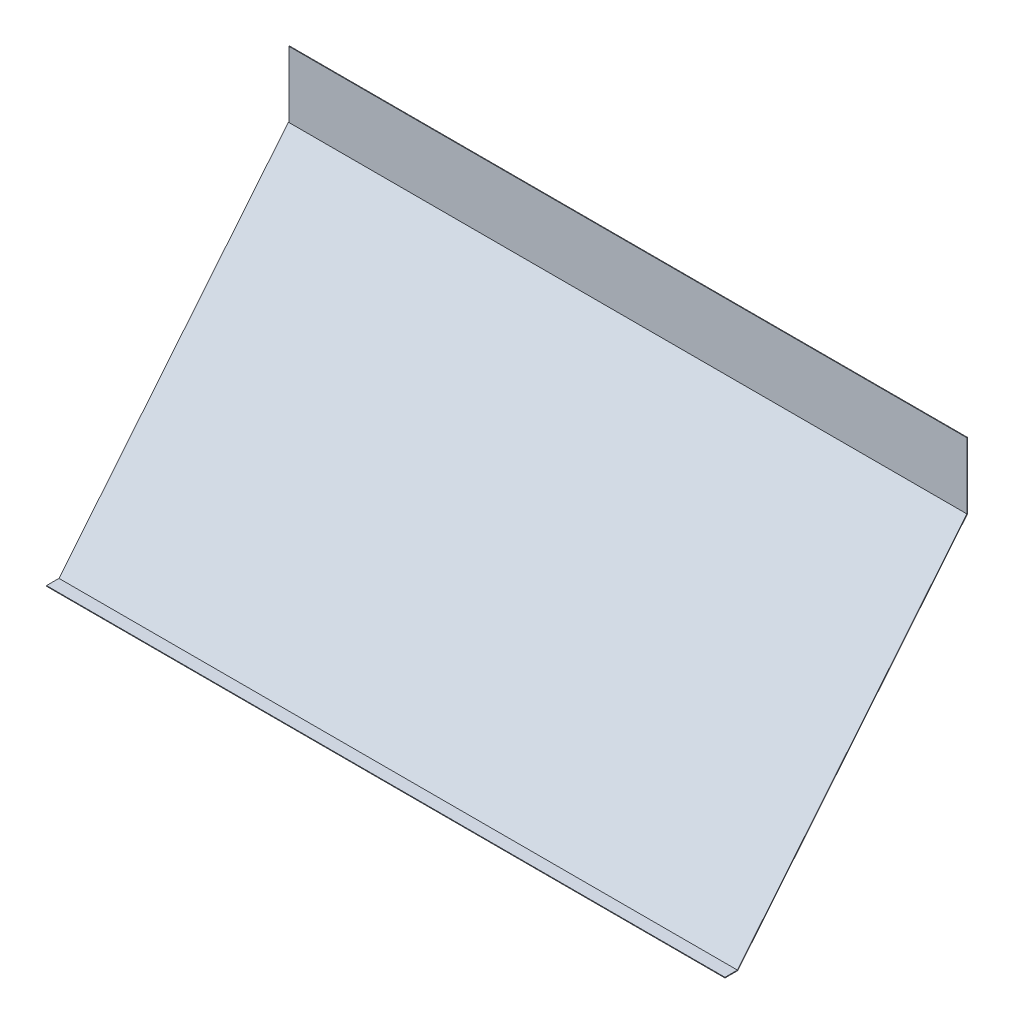
ISO-10303-21;
HEADER;
FILE_DESCRIPTION(('STEP AP214'),'2;1');
FILE_NAME('part.step','',(''),(''),'','','');
FILE_SCHEMA(('AUTOMOTIVE_DESIGN { 1 0 10303 214 1 1 1 1 }'));
ENDSEC;
DATA;
#1=APPLICATION_CONTEXT('core data for automotive mechanical design processes');
#2=APPLICATION_PROTOCOL_DEFINITION('international standard','automotive_design',2000,#1);
#3=PRODUCT_CONTEXT('',#1,'mechanical');
#4=PRODUCT('Part','Part','',(#3));
#5=PRODUCT_RELATED_PRODUCT_CATEGORY('part','',(#4));
#6=PRODUCT_DEFINITION_FORMATION('','',#4);
#7=PRODUCT_DEFINITION_CONTEXT('part definition',#1,'design');
#8=PRODUCT_DEFINITION('design','',#6,#7);
#9=PRODUCT_DEFINITION_SHAPE('','',#8);
#10=(LENGTH_UNIT() NAMED_UNIT(*) SI_UNIT(.MILLI.,.METRE.));
#11=(NAMED_UNIT(*) PLANE_ANGLE_UNIT() SI_UNIT($,.RADIAN.));
#12=(NAMED_UNIT(*) SI_UNIT($,.STERADIAN.) SOLID_ANGLE_UNIT());
#13=UNCERTAINTY_MEASURE_WITH_UNIT(LENGTH_MEASURE(1.E-05),#10,'distance_accuracy_value','');
#14=(GEOMETRIC_REPRESENTATION_CONTEXT(3) GLOBAL_UNCERTAINTY_ASSIGNED_CONTEXT((#13)) GLOBAL_UNIT_ASSIGNED_CONTEXT((#10,
#11,#12)) REPRESENTATION_CONTEXT('',''));
#15=CARTESIAN_POINT('',(0.,0.,0.));
#16=DIRECTION('',(0.,0.,1.));
#17=DIRECTION('',(1.,0.,0.));
#18=AXIS2_PLACEMENT_3D('',#15,#16,#17);
#19=CARTESIAN_POINT('',(545.,1.,-10.));
#20=DIRECTION('',(-1.,0.,0.));
#21=DIRECTION('',(0.,0.,1.));
#22=AXIS2_PLACEMENT_3D('',#19,#20,#21);
#23=PLANE('',#22);
#24=DIRECTION('',(0.,0.,-1.));
#25=VECTOR('',#24,1.);
#26=CARTESIAN_POINT('',(545.,0.,-10.));
#27=LINE('',#26,#25);
#28=CARTESIAN_POINT('',(545.,0.,10.));
#29=VERTEX_POINT('',#28);
#30=CARTESIAN_POINT('',(545.,0.,-10.));
#31=VERTEX_POINT('',#30);
#32=EDGE_CURVE('E190',#29,#31,#27,.T.);
#33=ORIENTED_EDGE('',*,*,#32,.T.);
#34=CARTESIAN_POINT('',(545.,1.,-10.));
#35=DIRECTION('',(-1.,0.,0.));
#36=DIRECTION('',(0.,0.,1.));
#37=AXIS2_PLACEMENT_3D('',#34,#35,#36);
#38=CIRCLE('',#37,1.);
#39=CARTESIAN_POINT('',(545.,0.366619127372445,-10.7738402097265));
#40=VERTEX_POINT('',#39);
#41=EDGE_CURVE('E182',#40,#31,#38,.T.);
#42=ORIENTED_EDGE('',*,*,#41,.F.);
#43=DIRECTION('',(0.,-0.773840209726502,0.633380872627555));
#44=VECTOR('',#43,1.);
#45=CARTESIAN_POINT('',(545.,450.741621188197,-379.401508078963));
#46=LINE('',#45,#44);
#47=CARTESIAN_POINT('',(545.,450.741621188197,-379.401508078963));
#48=VERTEX_POINT('',#47);
#49=EDGE_CURVE('E172',#48,#40,#46,.T.);
#50=ORIENTED_EDGE('',*,*,#49,.F.);
#51=CARTESIAN_POINT('',(545.,451.375002060824,-378.627667869237));
#52=DIRECTION('',(1.,0.,0.));
#53=DIRECTION('',(0.,0.,1.));
#54=AXIS2_PLACEMENT_3D('',#51,#52,#53);
#55=CIRCLE('',#54,0.999999999999975);
#56=CARTESIAN_POINT('',(545.,451.375002060824,-379.627667869237));
#57=VERTEX_POINT('',#56);
#58=EDGE_CURVE('E149',#48,#57,#55,.T.);
#59=ORIENTED_EDGE('',*,*,#58,.T.);
#60=DIRECTION('',(0.,-1.,0.));
#61=VECTOR('',#60,1.);
#62=CARTESIAN_POINT('',(545.,557.375002060909,-379.627667869231));
#63=LINE('',#62,#61);
#64=CARTESIAN_POINT('',(545.,557.375002060909,-379.627667869231));
#65=VERTEX_POINT('',#64);
#66=EDGE_CURVE('E130',#65,#57,#63,.T.);
#67=ORIENTED_EDGE('',*,*,#66,.F.);
#68=DIRECTION('',(0.,0.,-1.));
#69=VECTOR('',#68,1.);
#70=CARTESIAN_POINT('',(545.,557.375002060909,-378.627667869231));
#71=LINE('',#70,#69);
#72=CARTESIAN_POINT('',(545.,557.375002060909,-378.627667869231));
#73=VERTEX_POINT('',#72);
#74=EDGE_CURVE('E136',#73,#65,#71,.T.);
#75=ORIENTED_EDGE('',*,*,#74,.F.);
#76=DIRECTION('',(0.,-1.,0.));
#77=VECTOR('',#76,1.);
#78=CARTESIAN_POINT('',(545.,557.375002060909,-378.627667869231));
#79=LINE('',#78,#77);
#80=CARTESIAN_POINT('',(545.,451.375002060824,-378.627667869237));
#81=VERTEX_POINT('',#80);
#82=EDGE_CURVE('E224',#73,#81,#79,.T.);
#83=ORIENTED_EDGE('',*,*,#82,.T.);
#84=DIRECTION('',(0.,-0.773840209726502,0.633380872627555));
#85=VECTOR('',#84,1.);
#86=CARTESIAN_POINT('',(545.,451.375002060824,-378.627667869237));
#87=LINE('',#86,#85);
#88=CARTESIAN_POINT('',(545.,1.,-10.));
#89=VERTEX_POINT('',#88);
#90=EDGE_CURVE('E175',#81,#89,#87,.T.);
#91=ORIENTED_EDGE('',*,*,#90,.T.);
#92=DIRECTION('',(0.,0.,-1.));
#93=VECTOR('',#92,1.);
#94=CARTESIAN_POINT('',(545.,1.,-10.));
#95=LINE('',#94,#93);
#96=CARTESIAN_POINT('',(545.,1.,10.));
#97=VERTEX_POINT('',#96);
#98=EDGE_CURVE('E81',#97,#89,#95,.T.);
#99=ORIENTED_EDGE('',*,*,#98,.F.);
#100=DIRECTION('',(0.,-1.,0.));
#101=VECTOR('',#100,1.);
#102=CARTESIAN_POINT('',(545.,1.,10.));
#103=LINE('',#102,#101);
#104=EDGE_CURVE('E43',#97,#29,#103,.T.);
#105=ORIENTED_EDGE('',*,*,#104,.T.);
#106=EDGE_LOOP('',(#33,#42,#50,#59,#67,#75,#83,#91,#99,#105));
#107=FACE_BOUND('',#106,.T.);
#108=ADVANCED_FACE('F36',(#107),#23,.F.);
#109=CARTESIAN_POINT('',(-545.,1.,-10.));
#110=DIRECTION('',(1.,0.,0.));
#111=DIRECTION('',(0.,0.,-1.));
#112=AXIS2_PLACEMENT_3D('',#109,#110,#111);
#113=PLANE('',#112);
#114=DIRECTION('',(0.,0.,1.));
#115=VECTOR('',#114,1.);
#116=CARTESIAN_POINT('',(-545.,0.,-10.));
#117=LINE('',#116,#115);
#118=CARTESIAN_POINT('',(-545.,0.,-10.));
#119=VERTEX_POINT('',#118);
#120=CARTESIAN_POINT('',(-545.,0.,10.));
#121=VERTEX_POINT('',#120);
#122=EDGE_CURVE('E201',#119,#121,#117,.T.);
#123=ORIENTED_EDGE('',*,*,#122,.T.);
#124=DIRECTION('',(0.,-1.,0.));
#125=VECTOR('',#124,1.);
#126=CARTESIAN_POINT('',(-545.,1.,10.));
#127=LINE('',#126,#125);
#128=CARTESIAN_POINT('',(-545.,1.,10.));
#129=VERTEX_POINT('',#128);
#130=EDGE_CURVE('E11',#129,#121,#127,.T.);
#131=ORIENTED_EDGE('',*,*,#130,.F.);
#132=DIRECTION('',(0.,0.,1.));
#133=VECTOR('',#132,1.);
#134=CARTESIAN_POINT('',(-545.,1.,-10.));
#135=LINE('',#134,#133);
#136=CARTESIAN_POINT('',(-545.,1.,-10.));
#137=VERTEX_POINT('',#136);
#138=EDGE_CURVE('E194',#137,#129,#135,.T.);
#139=ORIENTED_EDGE('',*,*,#138,.F.);
#140=DIRECTION('',(0.,-0.773840209726502,0.633380872627555));
#141=VECTOR('',#140,1.);
#142=CARTESIAN_POINT('',(-545.,451.375002060824,-378.627667869237));
#143=LINE('',#142,#141);
#144=CARTESIAN_POINT('',(-545.,451.375002060824,-378.627667869237));
#145=VERTEX_POINT('',#144);
#146=EDGE_CURVE('E178',#145,#137,#143,.T.);
#147=ORIENTED_EDGE('',*,*,#146,.F.);
#148=DIRECTION('',(0.,1.66533453693783E-13,1.));
#149=VECTOR('',#148,1.);
#150=CARTESIAN_POINT('',(-545.,451.375002060824,-378.627667869237));
#151=LINE('',#150,#149);
#152=CARTESIAN_POINT('',(-545.,451.375002060824,-379.627667869237));
#153=VERTEX_POINT('',#152);
#154=EDGE_CURVE('E159',#153,#145,#151,.T.);
#155=ORIENTED_EDGE('',*,*,#154,.F.);
#156=CARTESIAN_POINT('',(-545.,451.375002060824,-378.627667869237));
#157=DIRECTION('',(1.,0.,0.));
#158=DIRECTION('',(0.,0.,1.));
#159=AXIS2_PLACEMENT_3D('',#156,#157,#158);
#160=CIRCLE('',#159,0.999999999999975);
#161=CARTESIAN_POINT('',(-545.,450.741621188197,-379.401508078963));
#162=VERTEX_POINT('',#161);
#163=EDGE_CURVE('E151',#162,#153,#160,.T.);
#164=ORIENTED_EDGE('',*,*,#163,.F.);
#165=DIRECTION('',(0.,-0.773840209726502,0.633380872627555));
#166=VECTOR('',#165,1.);
#167=CARTESIAN_POINT('',(-545.,450.741621188197,-379.401508078963));
#168=LINE('',#167,#166);
#169=CARTESIAN_POINT('',(-545.,0.366619127372443,-10.7738402097265));
#170=VERTEX_POINT('',#169);
#171=EDGE_CURVE('E169',#162,#170,#168,.T.);
#172=ORIENTED_EDGE('',*,*,#171,.T.);
#173=CARTESIAN_POINT('',(-545.,1.,-10.));
#174=DIRECTION('',(-1.,0.,0.));
#175=DIRECTION('',(0.,0.,1.));
#176=AXIS2_PLACEMENT_3D('',#173,#174,#175);
#177=CIRCLE('',#176,1.);
#178=EDGE_CURVE('E181',#170,#119,#177,.T.);
#179=ORIENTED_EDGE('',*,*,#178,.T.);
#180=EDGE_LOOP('',(#123,#131,#139,#147,#155,#164,#172,#179));
#181=FACE_BOUND('',#180,.T.);
#182=ADVANCED_FACE('F241',(#181),#113,.F.);
#183=CARTESIAN_POINT('',(-545.,1.,10.));
#184=DIRECTION('',(0.,0.,-1.));
#185=DIRECTION('',(-1.,0.,0.));
#186=AXIS2_PLACEMENT_3D('',#183,#184,#185);
#187=PLANE('',#186);
#188=DIRECTION('',(1.,0.,0.));
#189=VECTOR('',#188,1.);
#190=CARTESIAN_POINT('',(-545.,0.,10.));
#191=LINE('',#190,#189);
#192=EDGE_CURVE('E76',#121,#29,#191,.T.);
#193=ORIENTED_EDGE('',*,*,#192,.T.);
#194=ORIENTED_EDGE('',*,*,#104,.F.);
#195=DIRECTION('',(1.,0.,0.));
#196=VECTOR('',#195,1.);
#197=CARTESIAN_POINT('',(-545.,1.,10.));
#198=LINE('',#197,#196);
#199=EDGE_CURVE('E59',#129,#97,#198,.T.);
#200=ORIENTED_EDGE('',*,*,#199,.F.);
#201=ORIENTED_EDGE('',*,*,#130,.T.);
#202=EDGE_LOOP('',(#193,#194,#200,#201));
#203=FACE_BOUND('',#202,.T.);
#204=ADVANCED_FACE('F245',(#203),#187,.F.);
#205=CARTESIAN_POINT('',(0.,1.,0.));
#206=DIRECTION('',(0.,1.,0.));
#207=DIRECTION('',(0.,0.,1.));
#208=AXIS2_PLACEMENT_3D('',#205,#206,#207);
#209=PLANE('',#208);
#210=ORIENTED_EDGE('',*,*,#98,.T.);
#211=DIRECTION('',(-1.,0.,0.));
#212=VECTOR('',#211,1.);
#213=CARTESIAN_POINT('',(-545.,1.,-10.));
#214=LINE('',#213,#212);
#215=EDGE_CURVE('E192',#89,#137,#214,.T.);
#216=ORIENTED_EDGE('',*,*,#215,.T.);
#217=ORIENTED_EDGE('',*,*,#138,.T.);
#218=ORIENTED_EDGE('',*,*,#199,.T.);
#219=EDGE_LOOP('',(#210,#216,#217,#218));
#220=FACE_BOUND('',#219,.T.);
#221=ADVANCED_FACE('F250',(#220),#209,.T.);
#222=CARTESIAN_POINT('',(0.,0.,0.));
#223=DIRECTION('',(0.,1.,0.));
#224=DIRECTION('',(0.,0.,1.));
#225=AXIS2_PLACEMENT_3D('',#222,#223,#224);
#226=PLANE('',#225);
#227=ORIENTED_EDGE('',*,*,#32,.F.);
#228=ORIENTED_EDGE('',*,*,#192,.F.);
#229=ORIENTED_EDGE('',*,*,#122,.F.);
#230=DIRECTION('',(-1.,0.,0.));
#231=VECTOR('',#230,1.);
#232=CARTESIAN_POINT('',(-545.,0.,-10.));
#233=LINE('',#232,#231);
#234=EDGE_CURVE('E198',#31,#119,#233,.T.);
#235=ORIENTED_EDGE('',*,*,#234,.F.);
#236=EDGE_LOOP('',(#227,#228,#229,#235));
#237=FACE_BOUND('',#236,.T.);
#238=ADVANCED_FACE('F207',(#237),#226,.F.);
#239=CARTESIAN_POINT('',(545.,1.,-10.));
#240=DIRECTION('',(-1.,0.,0.));
#241=DIRECTION('',(0.,0.,1.));
#242=AXIS2_PLACEMENT_3D('',#239,#240,#241);
#243=CYLINDRICAL_SURFACE('',#242,1.);
#244=ORIENTED_EDGE('',*,*,#178,.F.);
#245=DIRECTION('',(-1.,0.,0.));
#246=VECTOR('',#245,1.);
#247=CARTESIAN_POINT('',(545.,0.366619127372445,-10.7738402097265));
#248=LINE('',#247,#246);
#249=EDGE_CURVE('E185',#40,#170,#248,.T.);
#250=ORIENTED_EDGE('',*,*,#249,.F.);
#251=ORIENTED_EDGE('',*,*,#41,.T.);
#252=ORIENTED_EDGE('',*,*,#234,.T.);
#253=EDGE_LOOP('',(#244,#250,#251,#252));
#254=FACE_BOUND('',#253,.T.);
#255=ADVANCED_FACE('F209',(#254),#243,.T.);
#256=CARTESIAN_POINT('',(-545.,451.375002060824,-378.627667869237));
#257=DIRECTION('',(0.,-0.633380872627555,-0.773840209726502));
#258=DIRECTION('',(0.,0.773840209726503,-0.633380872627555));
#259=AXIS2_PLACEMENT_3D('',#256,#257,#258);
#260=PLANE('',#259);
#261=ORIENTED_EDGE('',*,*,#215,.F.);
#262=ORIENTED_EDGE('',*,*,#90,.F.);
#263=DIRECTION('',(1.,0.,0.));
#264=VECTOR('',#263,1.);
#265=CARTESIAN_POINT('',(545.,451.375002060909,-378.627667869237));
#266=LINE('',#265,#264);
#267=CARTESIAN_POINT('',(-544.,451.375002060909,-378.627667869237));
#268=VERTEX_POINT('',#267);
#269=EDGE_CURVE('E145',#268,#81,#266,.T.);
#270=ORIENTED_EDGE('',*,*,#269,.F.);
#271=DIRECTION('',(1.,0.,0.));
#272=VECTOR('',#271,1.);
#273=CARTESIAN_POINT('',(-545.,451.375002060824,-378.627667869237));
#274=LINE('',#273,#272);
#275=EDGE_CURVE('E164',#145,#268,#274,.T.);
#276=ORIENTED_EDGE('',*,*,#275,.F.);
#277=ORIENTED_EDGE('',*,*,#146,.T.);
#278=EDGE_LOOP('',(#261,#262,#270,#276,#277));
#279=FACE_BOUND('',#278,.T.);
#280=ADVANCED_FACE('F259',(#279),#260,.F.);
#281=CARTESIAN_POINT('',(-545.,450.741621188197,-379.401508078963));
#282=DIRECTION('',(0.,0.633380872627555,0.773840209726502));
#283=DIRECTION('',(0.,-0.773840209726503,0.633380872627555));
#284=AXIS2_PLACEMENT_3D('',#281,#282,#283);
#285=PLANE('',#284);
#286=ORIENTED_EDGE('',*,*,#249,.T.);
#287=ORIENTED_EDGE('',*,*,#171,.F.);
#288=DIRECTION('',(-1.,0.,0.));
#289=VECTOR('',#288,1.);
#290=CARTESIAN_POINT('',(-545.,450.741621188197,-379.401508078963));
#291=LINE('',#290,#289);
#292=EDGE_CURVE('E166',#48,#162,#291,.T.);
#293=ORIENTED_EDGE('',*,*,#292,.F.);
#294=ORIENTED_EDGE('',*,*,#49,.T.);
#295=EDGE_LOOP('',(#286,#287,#293,#294));
#296=FACE_BOUND('',#295,.T.);
#297=ADVANCED_FACE('F212',(#296),#285,.F.);
#298=CARTESIAN_POINT('',(-545.,451.375002060824,-378.627667869237));
#299=DIRECTION('',(0.,1.,-1.66533453693783E-13));
#300=DIRECTION('',(0.,1.66533453693783E-13,1.));
#301=AXIS2_PLACEMENT_3D('',#298,#299,#300);
#302=PLANE('',#301);
#303=DIRECTION('',(0.,0.,1.));
#304=VECTOR('',#303,1.);
#305=CARTESIAN_POINT('',(-544.,451.375002060909,-378.627667869237));
#306=LINE('',#305,#304);
#307=CARTESIAN_POINT('',(-544.,451.375002060824,-379.627667869237));
#308=VERTEX_POINT('',#307);
#309=EDGE_CURVE('E50',#308,#268,#306,.T.);
#310=ORIENTED_EDGE('',*,*,#309,.F.);
#311=DIRECTION('',(1.,0.,0.));
#312=VECTOR('',#311,1.);
#313=CARTESIAN_POINT('',(-545.,451.375002060824,-379.627667869237));
#314=LINE('',#313,#312);
#315=EDGE_CURVE('E161',#153,#308,#314,.T.);
#316=ORIENTED_EDGE('',*,*,#315,.F.);
#317=ORIENTED_EDGE('',*,*,#154,.T.);
#318=ORIENTED_EDGE('',*,*,#275,.T.);
#319=EDGE_LOOP('',(#310,#316,#317,#318));
#320=FACE_BOUND('',#319,.T.);
#321=ADVANCED_FACE('F265',(#320),#302,.T.);
#322=CARTESIAN_POINT('',(-545.,451.375002060824,-378.627667869237));
#323=DIRECTION('',(1.,0.,0.));
#324=DIRECTION('',(0.,0.,-1.));
#325=AXIS2_PLACEMENT_3D('',#322,#323,#324);
#326=CYLINDRICAL_SURFACE('',#325,0.999999999999975);
#327=ORIENTED_EDGE('',*,*,#58,.F.);
#328=ORIENTED_EDGE('',*,*,#292,.T.);
#329=ORIENTED_EDGE('',*,*,#163,.T.);
#330=ORIENTED_EDGE('',*,*,#315,.T.);
#331=DIRECTION('',(-1.,0.,0.));
#332=VECTOR('',#331,1.);
#333=CARTESIAN_POINT('',(545.,451.375002060909,-379.627667869237));
#334=LINE('',#333,#332);
#335=EDGE_CURVE('E216',#57,#308,#334,.T.);
#336=ORIENTED_EDGE('',*,*,#335,.F.);
#337=EDGE_LOOP('',(#327,#328,#329,#330,#336));
#338=FACE_BOUND('',#337,.T.);
#339=ADVANCED_FACE('F215',(#338),#326,.T.);
#340=CARTESIAN_POINT('',(545.,557.375002060909,-379.627667869231));
#341=DIRECTION('',(0.,0.,1.));
#342=DIRECTION('',(0.,-1.,0.));
#343=AXIS2_PLACEMENT_3D('',#340,#341,#342);
#344=PLANE('',#343);
#345=ORIENTED_EDGE('',*,*,#335,.T.);
#346=DIRECTION('',(0.,-1.,0.));
#347=VECTOR('',#346,1.);
#348=CARTESIAN_POINT('',(-544.,557.375002060909,-379.627667869231));
#349=LINE('',#348,#347);
#350=CARTESIAN_POINT('',(-544.,557.375002060909,-379.627667869231));
#351=VERTEX_POINT('',#350);
#352=EDGE_CURVE('E132',#351,#308,#349,.T.);
#353=ORIENTED_EDGE('',*,*,#352,.F.);
#354=DIRECTION('',(-1.,0.,0.));
#355=VECTOR('',#354,1.);
#356=CARTESIAN_POINT('',(545.,557.375002060909,-379.627667869231));
#357=LINE('',#356,#355);
#358=EDGE_CURVE('E125',#65,#351,#357,.T.);
#359=ORIENTED_EDGE('',*,*,#358,.F.);
#360=ORIENTED_EDGE('',*,*,#66,.T.);
#361=EDGE_LOOP('',(#345,#353,#359,#360));
#362=FACE_BOUND('',#361,.T.);
#363=ADVANCED_FACE('F128',(#362),#344,.F.);
#364=CARTESIAN_POINT('',(-544.,557.375002060909,-378.627667869231));
#365=DIRECTION('',(1.,0.,0.));
#366=DIRECTION('',(0.,0.,-1.));
#367=AXIS2_PLACEMENT_3D('',#364,#365,#366);
#368=PLANE('',#367);
#369=ORIENTED_EDGE('',*,*,#309,.T.);
#370=DIRECTION('',(0.,-1.,0.));
#371=VECTOR('',#370,1.);
#372=CARTESIAN_POINT('',(-544.,557.375002060909,-378.627667869231));
#373=LINE('',#372,#371);
#374=CARTESIAN_POINT('',(-544.,557.375002060909,-378.627667869231));
#375=VERTEX_POINT('',#374);
#376=EDGE_CURVE('E153',#375,#268,#373,.T.);
#377=ORIENTED_EDGE('',*,*,#376,.F.);
#378=DIRECTION('',(0.,0.,1.));
#379=VECTOR('',#378,1.);
#380=CARTESIAN_POINT('',(-544.,557.375002060909,-378.627667869231));
#381=LINE('',#380,#379);
#382=EDGE_CURVE('E135',#351,#375,#381,.T.);
#383=ORIENTED_EDGE('',*,*,#382,.F.);
#384=ORIENTED_EDGE('',*,*,#352,.T.);
#385=EDGE_LOOP('',(#369,#377,#383,#384));
#386=FACE_BOUND('',#385,.T.);
#387=ADVANCED_FACE('F231',(#386),#368,.F.);
#388=CARTESIAN_POINT('',(545.,557.375002060909,-378.627667869231));
#389=DIRECTION('',(0.,0.,-1.));
#390=DIRECTION('',(0.,1.,0.));
#391=AXIS2_PLACEMENT_3D('',#388,#389,#390);
#392=PLANE('',#391);
#393=ORIENTED_EDGE('',*,*,#269,.T.);
#394=ORIENTED_EDGE('',*,*,#82,.F.);
#395=DIRECTION('',(1.,0.,0.));
#396=VECTOR('',#395,1.);
#397=CARTESIAN_POINT('',(545.,557.375002060909,-378.627667869231));
#398=LINE('',#397,#396);
#399=EDGE_CURVE('E141',#375,#73,#398,.T.);
#400=ORIENTED_EDGE('',*,*,#399,.F.);
#401=ORIENTED_EDGE('',*,*,#376,.T.);
#402=EDGE_LOOP('',(#393,#394,#400,#401));
#403=FACE_BOUND('',#402,.T.);
#404=ADVANCED_FACE('F228',(#403),#392,.F.);
#405=CARTESIAN_POINT('',(0.,557.375002060887,3.09405280319259E-11));
#406=DIRECTION('',(0.,1.,0.));
#407=DIRECTION('',(0.,0.,1.));
#408=AXIS2_PLACEMENT_3D('',#405,#406,#407);
#409=PLANE('',#408);
#410=ORIENTED_EDGE('',*,*,#74,.T.);
#411=ORIENTED_EDGE('',*,*,#358,.T.);
#412=ORIENTED_EDGE('',*,*,#382,.T.);
#413=ORIENTED_EDGE('',*,*,#399,.T.);
#414=EDGE_LOOP('',(#410,#411,#412,#413));
#415=FACE_BOUND('',#414,.T.);
#416=ADVANCED_FACE('F139',(#415),#409,.T.);
#417=CLOSED_SHELL('',(#108,#182,#204,#221,#238,#255,#280,#297,#321,#339,#363,#387,#404,#416));
#418=MANIFOLD_SOLID_BREP('B2',#417);
#419=ADVANCED_BREP_SHAPE_REPRESENTATION('',(#18,#418),#14);
#420=SHAPE_DEFINITION_REPRESENTATION(#9,#419);
ENDSEC;
END-ISO-10303-21;
